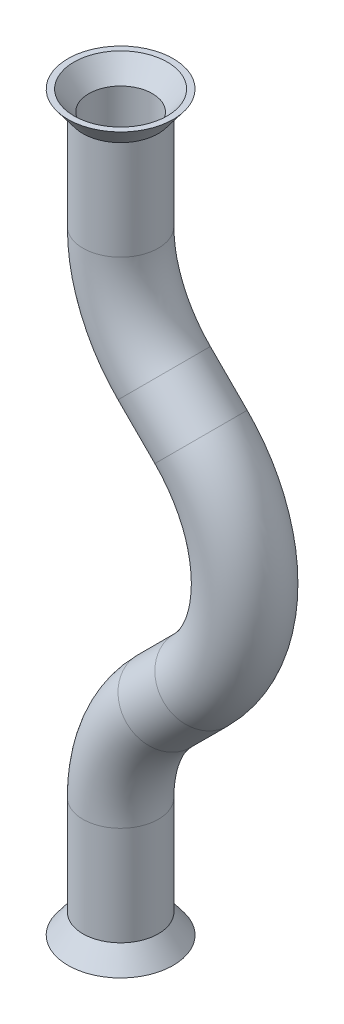
ISO-10303-21;
HEADER;
FILE_DESCRIPTION(('STEP AP214'),'2;1');
FILE_NAME('part.step','',(''),(''),'','','');
FILE_SCHEMA(('AUTOMOTIVE_DESIGN { 1 0 10303 214 1 1 1 1 }'));
ENDSEC;
DATA;
#1=APPLICATION_CONTEXT('core data for automotive mechanical design processes');
#2=APPLICATION_PROTOCOL_DEFINITION('international standard','automotive_design',2000,#1);
#3=PRODUCT_CONTEXT('',#1,'mechanical');
#4=PRODUCT('Part','Part','',(#3));
#5=PRODUCT_RELATED_PRODUCT_CATEGORY('part','',(#4));
#6=PRODUCT_DEFINITION_FORMATION('','',#4);
#7=PRODUCT_DEFINITION_CONTEXT('part definition',#1,'design');
#8=PRODUCT_DEFINITION('design','',#6,#7);
#9=PRODUCT_DEFINITION_SHAPE('','',#8);
#10=(LENGTH_UNIT() NAMED_UNIT(*) SI_UNIT(.MILLI.,.METRE.));
#11=(NAMED_UNIT(*) PLANE_ANGLE_UNIT() SI_UNIT($,.RADIAN.));
#12=(NAMED_UNIT(*) SI_UNIT($,.STERADIAN.) SOLID_ANGLE_UNIT());
#13=UNCERTAINTY_MEASURE_WITH_UNIT(LENGTH_MEASURE(1.E-05),#10,'distance_accuracy_value','');
#14=(GEOMETRIC_REPRESENTATION_CONTEXT(3) GLOBAL_UNCERTAINTY_ASSIGNED_CONTEXT((#13)) GLOBAL_UNIT_ASSIGNED_CONTEXT((#10,
#11,#12)) REPRESENTATION_CONTEXT('',''));
#15=CARTESIAN_POINT('',(0.,0.,0.));
#16=DIRECTION('',(0.,0.,1.));
#17=DIRECTION('',(1.,0.,0.));
#18=AXIS2_PLACEMENT_3D('',#15,#16,#17);
#19=CARTESIAN_POINT('',(0.,0.,0.));
#20=DIRECTION('',(0.,1.,0.));
#21=DIRECTION('',(0.,0.,1.));
#22=AXIS2_PLACEMENT_3D('',#19,#20,#21);
#23=CYLINDRICAL_SURFACE('',#22,4.826);
#24=CARTESIAN_POINT('',(0.,12.7,0.));
#25=DIRECTION('',(0.,1.,0.));
#26=DIRECTION('',(0.,0.,1.));
#27=AXIS2_PLACEMENT_3D('',#24,#25,#26);
#28=CIRCLE('',#27,4.826);
#29=CARTESIAN_POINT('',(-4.826,12.7,0.));
#30=VERTEX_POINT('',#29);
#31=EDGE_CURVE('E61',#30,#30,#28,.T.);
#32=ORIENTED_EDGE('',*,*,#31,.F.);
#33=EDGE_LOOP('',(#32));
#34=FACE_BOUND('',#33,.T.);
#35=CARTESIAN_POINT('',(0.,0.,0.));
#36=DIRECTION('',(0.,-1.,0.));
#37=DIRECTION('',(0.,0.,-1.));
#38=AXIS2_PLACEMENT_3D('',#35,#36,#37);
#39=CIRCLE('',#38,4.826);
#40=CARTESIAN_POINT('',(0.,0.,-4.826));
#41=VERTEX_POINT('',#40);
#42=EDGE_CURVE('E143',#41,#41,#39,.T.);
#43=ORIENTED_EDGE('',*,*,#42,.F.);
#44=EDGE_LOOP('',(#43));
#45=FACE_BOUND('',#44,.T.);
#46=ADVANCED_FACE('F37',(#34,#45),#23,.T.);
#47=CARTESIAN_POINT('',(19.05,12.7,0.));
#48=DIRECTION('',(0.,0.,-1.));
#49=DIRECTION('',(-1.,0.,0.));
#50=AXIS2_PLACEMENT_3D('',#47,#48,#49);
#51=TOROIDAL_SURFACE('',#50,19.05,4.826);
#52=CARTESIAN_POINT('',(5.5796158183963,26.1703841816037,0.));
#53=DIRECTION('',(0.707106781186549,0.707106781186546,0.));
#54=DIRECTION('',(0.,0.,1.));
#55=AXIS2_PLACEMENT_3D('',#52,#53,#54);
#56=CIRCLE('',#55,4.826);
#57=CARTESIAN_POINT('',(2.16711849239002,29.58288150761,0.));
#58=VERTEX_POINT('',#57);
#59=EDGE_CURVE('E65',#58,#58,#56,.T.);
#60=CARTESIAN_POINT('',(19.05,12.7,0.));
#61=DIRECTION('',(0.,0.,-1.));
#62=DIRECTION('',(-1.,0.,0.));
#63=AXIS2_PLACEMENT_3D('',#60,#61,#62);
#64=CIRCLE('',#63,23.876);
#65=EDGE_CURVE('',#30,#58,#64,.T.);
#66=ORIENTED_EDGE('',*,*,#31,.T.);
#67=ORIENTED_EDGE('',*,*,#59,.F.);
#68=ORIENTED_EDGE('',*,*,#65,.T.);
#69=ORIENTED_EDGE('',*,*,#65,.F.);
#70=EDGE_LOOP('',(#66,#68,#67,#69));
#71=FACE_BOUND('',#70,.T.);
#72=ADVANCED_FACE('F120',(#71),#51,.T.);
#73=CARTESIAN_POINT('',(5.5796158183963,26.1703841816037,0.));
#74=DIRECTION('',(0.707106781186547,0.707106781186548,0.));
#75=DIRECTION('',(-0.707106781186548,0.707106781186547,0.));
#76=AXIS2_PLACEMENT_3D('',#73,#74,#75);
#77=CYLINDRICAL_SURFACE('',#76,4.826);
#78=CARTESIAN_POINT('',(10.2953841816037,30.8861525448112,0.));
#79=DIRECTION('',(0.707106781186547,0.707106781186548,0.));
#80=DIRECTION('',(0.,0.,1.));
#81=AXIS2_PLACEMENT_3D('',#78,#79,#80);
#82=CIRCLE('',#81,4.826);
#83=CARTESIAN_POINT('',(13.70788150761,27.4736552188049,0.));
#84=VERTEX_POINT('',#83);
#85=EDGE_CURVE('E70',#84,#84,#82,.T.);
#86=ORIENTED_EDGE('',*,*,#85,.F.);
#87=EDGE_LOOP('',(#86));
#88=FACE_BOUND('',#87,.T.);
#89=ORIENTED_EDGE('',*,*,#59,.T.);
#90=EDGE_LOOP('',(#89));
#91=FACE_BOUND('',#90,.T.);
#92=ADVANCED_FACE('F124',(#88,#91),#77,.T.);
#93=CARTESIAN_POINT('',(-3.175,44.3565367264149,0.));
#94=DIRECTION('',(0.,0.,1.));
#95=DIRECTION('',(1.,0.,0.));
#96=AXIS2_PLACEMENT_3D('',#93,#94,#95);
#97=TOROIDAL_SURFACE('',#96,19.05,4.826);
#98=CARTESIAN_POINT('',(10.2953841816037,57.8269209080187,0.));
#99=DIRECTION('',(-0.707106781186549,0.707106781186546,0.));
#100=DIRECTION('',(0.,0.,1.));
#101=AXIS2_PLACEMENT_3D('',#98,#99,#100);
#102=CIRCLE('',#101,4.826);
#103=CARTESIAN_POINT('',(13.70788150761,61.2394182340249,0.));
#104=VERTEX_POINT('',#103);
#105=EDGE_CURVE('E74',#104,#104,#102,.T.);
#106=CARTESIAN_POINT('',(-3.175,44.3565367264149,0.));
#107=DIRECTION('',(0.,0.,1.));
#108=DIRECTION('',(1.,0.,0.));
#109=AXIS2_PLACEMENT_3D('',#106,#107,#108);
#110=CIRCLE('',#109,23.876);
#111=EDGE_CURVE('',#84,#104,#110,.T.);
#112=ORIENTED_EDGE('',*,*,#85,.T.);
#113=ORIENTED_EDGE('',*,*,#105,.F.);
#114=ORIENTED_EDGE('',*,*,#111,.T.);
#115=ORIENTED_EDGE('',*,*,#111,.F.);
#116=EDGE_LOOP('',(#112,#114,#113,#115));
#117=FACE_BOUND('',#116,.T.);
#118=ADVANCED_FACE('F96',(#117),#97,.T.);
#119=CARTESIAN_POINT('',(10.2953841816037,57.8269209080187,0.));
#120=DIRECTION('',(-0.707106781186547,0.707106781186548,0.));
#121=DIRECTION('',(-0.707106781186548,-0.707106781186547,0.));
#122=AXIS2_PLACEMENT_3D('',#119,#120,#121);
#123=CYLINDRICAL_SURFACE('',#122,4.826);
#124=CARTESIAN_POINT('',(5.5796158183963,62.5426892712261,0.));
#125=DIRECTION('',(-0.707106781186547,0.707106781186548,0.));
#126=DIRECTION('',(0.,0.,1.));
#127=AXIS2_PLACEMENT_3D('',#124,#125,#126);
#128=CIRCLE('',#127,4.826);
#129=CARTESIAN_POINT('',(2.16711849239003,59.1301919452198,0.));
#130=VERTEX_POINT('',#129);
#131=EDGE_CURVE('E77',#130,#130,#128,.T.);
#132=ORIENTED_EDGE('',*,*,#131,.F.);
#133=EDGE_LOOP('',(#132));
#134=FACE_BOUND('',#133,.T.);
#135=ORIENTED_EDGE('',*,*,#105,.T.);
#136=EDGE_LOOP('',(#135));
#137=FACE_BOUND('',#136,.T.);
#138=ADVANCED_FACE('F89',(#134,#137),#123,.T.);
#139=CARTESIAN_POINT('',(19.05,76.0130734528298,0.));
#140=DIRECTION('',(0.,0.,-1.));
#141=DIRECTION('',(-1.,0.,0.));
#142=AXIS2_PLACEMENT_3D('',#139,#140,#141);
#143=TOROIDAL_SURFACE('',#142,19.05,4.826);
#144=CARTESIAN_POINT('',(0.,76.0130734528298,0.));
#145=DIRECTION('',(0.,1.,0.));
#146=DIRECTION('',(0.,0.,1.));
#147=AXIS2_PLACEMENT_3D('',#144,#145,#146);
#148=CIRCLE('',#147,4.826);
#149=CARTESIAN_POINT('',(-4.82599999999999,76.0130734528298,0.));
#150=VERTEX_POINT('',#149);
#151=EDGE_CURVE('E41',#150,#150,#148,.T.);
#152=CARTESIAN_POINT('',(19.05,76.0130734528298,0.));
#153=DIRECTION('',(0.,0.,-1.));
#154=DIRECTION('',(-1.,0.,0.));
#155=AXIS2_PLACEMENT_3D('',#152,#153,#154);
#156=CIRCLE('',#155,23.876);
#157=EDGE_CURVE('',#130,#150,#156,.T.);
#158=ORIENTED_EDGE('',*,*,#131,.T.);
#159=ORIENTED_EDGE('',*,*,#151,.F.);
#160=ORIENTED_EDGE('',*,*,#157,.T.);
#161=ORIENTED_EDGE('',*,*,#157,.F.);
#162=EDGE_LOOP('',(#158,#160,#159,#161));
#163=FACE_BOUND('',#162,.T.);
#164=ADVANCED_FACE('F87',(#163),#143,.T.);
#165=CARTESIAN_POINT('',(0.,76.0130734528298,0.));
#166=DIRECTION('',(0.,1.,0.));
#167=DIRECTION('',(-1.,0.,0.));
#168=AXIS2_PLACEMENT_3D('',#165,#166,#167);
#169=CYLINDRICAL_SURFACE('',#168,4.826);
#170=CARTESIAN_POINT('',(0.,88.7130734528298,0.));
#171=DIRECTION('',(0.,1.,0.));
#172=DIRECTION('',(0.,0.,1.));
#173=AXIS2_PLACEMENT_3D('',#170,#171,#172);
#174=CIRCLE('',#173,4.826);
#175=CARTESIAN_POINT('',(0.,88.7130734528298,4.826));
#176=VERTEX_POINT('',#175);
#177=EDGE_CURVE('E56',#176,#176,#174,.T.);
#178=ORIENTED_EDGE('',*,*,#177,.F.);
#179=EDGE_LOOP('',(#178));
#180=FACE_BOUND('',#179,.T.);
#181=ORIENTED_EDGE('',*,*,#151,.T.);
#182=EDGE_LOOP('',(#181));
#183=FACE_BOUND('',#182,.T.);
#184=ADVANCED_FACE('F39',(#180,#183),#169,.T.);
#185=CARTESIAN_POINT('',(0.,0.,0.));
#186=DIRECTION('',(0.,1.,0.));
#187=DIRECTION('',(0.,0.,1.));
#188=AXIS2_PLACEMENT_3D('',#185,#186,#187);
#189=CYLINDRICAL_SURFACE('',#188,4.064);
#190=CARTESIAN_POINT('',(0.,12.7,0.));
#191=DIRECTION('',(0.,1.,0.));
#192=DIRECTION('',(0.,0.,1.));
#193=AXIS2_PLACEMENT_3D('',#190,#191,#192);
#194=CIRCLE('',#193,4.064);
#195=CARTESIAN_POINT('',(-4.064,12.7,0.));
#196=VERTEX_POINT('',#195);
#197=EDGE_CURVE('E60',#196,#196,#194,.F.);
#198=ORIENTED_EDGE('',*,*,#197,.F.);
#199=EDGE_LOOP('',(#198));
#200=FACE_BOUND('',#199,.T.);
#201=CARTESIAN_POINT('',(0.,0.,0.));
#202=DIRECTION('',(0.,-1.,0.));
#203=DIRECTION('',(0.,0.,-1.));
#204=AXIS2_PLACEMENT_3D('',#201,#202,#203);
#205=CIRCLE('',#204,4.064);
#206=CARTESIAN_POINT('',(0.,0.,-4.064));
#207=VERTEX_POINT('',#206);
#208=EDGE_CURVE('E146',#207,#207,#205,.T.);
#209=ORIENTED_EDGE('',*,*,#208,.T.);
#210=EDGE_LOOP('',(#209));
#211=FACE_BOUND('',#210,.T.);
#212=ADVANCED_FACE('F94',(#200,#211),#189,.F.);
#213=CARTESIAN_POINT('',(19.05,12.7,0.));
#214=DIRECTION('',(0.,0.,-1.));
#215=DIRECTION('',(-1.,0.,0.));
#216=AXIS2_PLACEMENT_3D('',#213,#214,#215);
#217=TOROIDAL_SURFACE('',#216,19.05,4.064);
#218=CARTESIAN_POINT('',(5.5796158183963,26.1703841816037,0.));
#219=DIRECTION('',(0.707106781186549,0.707106781186546,0.));
#220=DIRECTION('',(0.,0.,1.));
#221=AXIS2_PLACEMENT_3D('',#218,#219,#220);
#222=CIRCLE('',#221,4.064);
#223=CARTESIAN_POINT('',(2.70593385965417,29.0440661403459,0.));
#224=VERTEX_POINT('',#223);
#225=EDGE_CURVE('E160',#224,#224,#222,.F.);
#226=CARTESIAN_POINT('',(19.05,12.7,0.));
#227=DIRECTION('',(0.,0.,-1.));
#228=DIRECTION('',(-1.,0.,0.));
#229=AXIS2_PLACEMENT_3D('',#226,#227,#228);
#230=CIRCLE('',#229,23.114);
#231=EDGE_CURVE('',#196,#224,#230,.T.);
#232=ORIENTED_EDGE('',*,*,#197,.T.);
#233=ORIENTED_EDGE('',*,*,#225,.F.);
#234=ORIENTED_EDGE('',*,*,#231,.T.);
#235=ORIENTED_EDGE('',*,*,#231,.F.);
#236=EDGE_LOOP('',(#232,#234,#233,#235));
#237=FACE_BOUND('',#236,.T.);
#238=ADVANCED_FACE('F181',(#237),#217,.F.);
#239=CARTESIAN_POINT('',(5.5796158183963,26.1703841816037,0.));
#240=DIRECTION('',(0.707106781186547,0.707106781186548,0.));
#241=DIRECTION('',(-0.707106781186548,0.707106781186547,0.));
#242=AXIS2_PLACEMENT_3D('',#239,#240,#241);
#243=CYLINDRICAL_SURFACE('',#242,4.064);
#244=CARTESIAN_POINT('',(10.2953841816037,30.8861525448112,0.));
#245=DIRECTION('',(0.707106781186547,0.707106781186548,0.));
#246=DIRECTION('',(0.,0.,1.));
#247=AXIS2_PLACEMENT_3D('',#244,#245,#246);
#248=CIRCLE('',#247,4.064);
#249=CARTESIAN_POINT('',(13.1690661403458,28.012470586069,0.));
#250=VERTEX_POINT('',#249);
#251=EDGE_CURVE('E164',#250,#250,#248,.F.);
#252=ORIENTED_EDGE('',*,*,#251,.F.);
#253=EDGE_LOOP('',(#252));
#254=FACE_BOUND('',#253,.T.);
#255=ORIENTED_EDGE('',*,*,#225,.T.);
#256=EDGE_LOOP('',(#255));
#257=FACE_BOUND('',#256,.T.);
#258=ADVANCED_FACE('F175',(#254,#257),#243,.F.);
#259=CARTESIAN_POINT('',(-3.175,44.3565367264149,0.));
#260=DIRECTION('',(0.,0.,1.));
#261=DIRECTION('',(1.,0.,0.));
#262=AXIS2_PLACEMENT_3D('',#259,#260,#261);
#263=TOROIDAL_SURFACE('',#262,19.05,4.064);
#264=CARTESIAN_POINT('',(10.2953841816037,57.8269209080187,0.));
#265=DIRECTION('',(-0.707106781186549,0.707106781186546,0.));
#266=DIRECTION('',(0.,0.,1.));
#267=AXIS2_PLACEMENT_3D('',#264,#265,#266);
#268=CIRCLE('',#267,4.064);
#269=CARTESIAN_POINT('',(13.1690661403458,60.7006028667608,0.));
#270=VERTEX_POINT('',#269);
#271=EDGE_CURVE('E52',#270,#270,#268,.F.);
#272=CARTESIAN_POINT('',(-3.175,44.3565367264149,0.));
#273=DIRECTION('',(0.,0.,1.));
#274=DIRECTION('',(1.,0.,0.));
#275=AXIS2_PLACEMENT_3D('',#272,#273,#274);
#276=CIRCLE('',#275,23.114);
#277=EDGE_CURVE('',#250,#270,#276,.T.);
#278=ORIENTED_EDGE('',*,*,#251,.T.);
#279=ORIENTED_EDGE('',*,*,#271,.F.);
#280=ORIENTED_EDGE('',*,*,#277,.T.);
#281=ORIENTED_EDGE('',*,*,#277,.F.);
#282=EDGE_LOOP('',(#278,#280,#279,#281));
#283=FACE_BOUND('',#282,.T.);
#284=ADVANCED_FACE('F172',(#283),#263,.F.);
#285=CARTESIAN_POINT('',(10.2953841816037,57.8269209080187,0.));
#286=DIRECTION('',(-0.707106781186547,0.707106781186548,0.));
#287=DIRECTION('',(-0.707106781186548,-0.707106781186547,0.));
#288=AXIS2_PLACEMENT_3D('',#285,#286,#287);
#289=CYLINDRICAL_SURFACE('',#288,4.064);
#290=CARTESIAN_POINT('',(5.5796158183963,62.5426892712261,0.));
#291=DIRECTION('',(-0.707106781186547,0.707106781186548,0.));
#292=DIRECTION('',(0.,0.,1.));
#293=AXIS2_PLACEMENT_3D('',#290,#291,#292);
#294=CIRCLE('',#293,4.064);
#295=CARTESIAN_POINT('',(2.70593385965418,59.6690073124839,0.));
#296=VERTEX_POINT('',#295);
#297=EDGE_CURVE('E46',#296,#296,#294,.F.);
#298=ORIENTED_EDGE('',*,*,#297,.F.);
#299=EDGE_LOOP('',(#298));
#300=FACE_BOUND('',#299,.T.);
#301=ORIENTED_EDGE('',*,*,#271,.T.);
#302=EDGE_LOOP('',(#301));
#303=FACE_BOUND('',#302,.T.);
#304=ADVANCED_FACE('F112',(#300,#303),#289,.F.);
#305=CARTESIAN_POINT('',(19.05,76.0130734528298,0.));
#306=DIRECTION('',(0.,0.,-1.));
#307=DIRECTION('',(-1.,0.,0.));
#308=AXIS2_PLACEMENT_3D('',#305,#306,#307);
#309=TOROIDAL_SURFACE('',#308,19.05,4.064);
#310=CARTESIAN_POINT('',(0.,76.0130734528298,0.));
#311=DIRECTION('',(0.,1.,0.));
#312=DIRECTION('',(0.,0.,1.));
#313=AXIS2_PLACEMENT_3D('',#310,#311,#312);
#314=CIRCLE('',#313,4.064);
#315=CARTESIAN_POINT('',(-4.06399999999999,76.0130734528298,0.));
#316=VERTEX_POINT('',#315);
#317=EDGE_CURVE('E10',#316,#316,#314,.F.);
#318=CARTESIAN_POINT('',(19.05,76.0130734528298,0.));
#319=DIRECTION('',(0.,0.,-1.));
#320=DIRECTION('',(-1.,0.,0.));
#321=AXIS2_PLACEMENT_3D('',#318,#319,#320);
#322=CIRCLE('',#321,23.114);
#323=EDGE_CURVE('',#296,#316,#322,.T.);
#324=ORIENTED_EDGE('',*,*,#297,.T.);
#325=ORIENTED_EDGE('',*,*,#317,.F.);
#326=ORIENTED_EDGE('',*,*,#323,.T.);
#327=ORIENTED_EDGE('',*,*,#323,.F.);
#328=EDGE_LOOP('',(#324,#326,#325,#327));
#329=FACE_BOUND('',#328,.T.);
#330=ADVANCED_FACE('F102',(#329),#309,.F.);
#331=CARTESIAN_POINT('',(0.,76.0130734528298,0.));
#332=DIRECTION('',(0.,1.,0.));
#333=DIRECTION('',(-1.,0.,0.));
#334=AXIS2_PLACEMENT_3D('',#331,#332,#333);
#335=CYLINDRICAL_SURFACE('',#334,4.064);
#336=CARTESIAN_POINT('',(0.,88.7130734528298,0.));
#337=DIRECTION('',(0.,1.,0.));
#338=DIRECTION('',(0.,0.,1.));
#339=AXIS2_PLACEMENT_3D('',#336,#337,#338);
#340=CIRCLE('',#339,4.064);
#341=CARTESIAN_POINT('',(0.,88.7130734528298,4.064));
#342=VERTEX_POINT('',#341);
#343=EDGE_CURVE('E276',#342,#342,#340,.T.);
#344=ORIENTED_EDGE('',*,*,#343,.T.);
#345=EDGE_LOOP('',(#344));
#346=FACE_BOUND('',#345,.T.);
#347=ORIENTED_EDGE('',*,*,#317,.T.);
#348=EDGE_LOOP('',(#347));
#349=FACE_BOUND('',#348,.T.);
#350=ADVANCED_FACE('F99',(#346,#349),#335,.F.);
#351=CARTESIAN_POINT('',(0.,0.,0.));
#352=DIRECTION('',(0.,-1.,0.));
#353=DIRECTION('',(0.,0.,-1.));
#354=AXIS2_PLACEMENT_3D('',#351,#352,#353);
#355=CONICAL_SURFACE('',#354,4.826,0.645771823237903);
#356=CARTESIAN_POINT('',(0.,-2.54,0.));
#357=DIRECTION('',(0.,-1.,0.));
#358=DIRECTION('',(0.,0.,-1.));
#359=AXIS2_PLACEMENT_3D('',#356,#357,#358);
#360=CIRCLE('',#359,6.7400272872611);
#361=CARTESIAN_POINT('',(0.,-2.54,-6.7400272872611));
#362=VERTEX_POINT('',#361);
#363=EDGE_CURVE('E66',#362,#362,#360,.T.);
#364=ORIENTED_EDGE('',*,*,#363,.F.);
#365=EDGE_LOOP('',(#364));
#366=FACE_BOUND('',#365,.T.);
#367=ORIENTED_EDGE('',*,*,#42,.T.);
#368=EDGE_LOOP('',(#367));
#369=FACE_BOUND('',#368,.T.);
#370=ADVANCED_FACE('F101',(#366,#369),#355,.T.);
#371=CARTESIAN_POINT('',(0.,-2.54,0.));
#372=DIRECTION('',(0.,-1.,0.));
#373=DIRECTION('',(0.,0.,-1.));
#374=AXIS2_PLACEMENT_3D('',#371,#372,#373);
#375=PLANE('',#374);
#376=CARTESIAN_POINT('',(0.,-2.54,0.));
#377=DIRECTION('',(0.,-1.,0.));
#378=DIRECTION('',(0.,0.,-1.));
#379=AXIS2_PLACEMENT_3D('',#376,#377,#378);
#380=CIRCLE('',#379,5.9780272872611);
#381=CARTESIAN_POINT('',(0.,-2.54,-5.9780272872611));
#382=VERTEX_POINT('',#381);
#383=EDGE_CURVE('E153',#382,#382,#380,.T.);
#384=ORIENTED_EDGE('',*,*,#383,.F.);
#385=EDGE_LOOP('',(#384));
#386=FACE_BOUND('',#385,.T.);
#387=ORIENTED_EDGE('',*,*,#363,.T.);
#388=EDGE_LOOP('',(#387));
#389=FACE_BOUND('',#388,.T.);
#390=ADVANCED_FACE('F109',(#386,#389),#375,.T.);
#391=CARTESIAN_POINT('',(0.,-2.54,0.));
#392=DIRECTION('',(0.,-1.,0.));
#393=DIRECTION('',(0.,0.,-1.));
#394=AXIS2_PLACEMENT_3D('',#391,#392,#393);
#395=CONICAL_SURFACE('',#394,5.9780272872611,0.645771823237903);
#396=ORIENTED_EDGE('',*,*,#383,.T.);
#397=EDGE_LOOP('',(#396));
#398=FACE_BOUND('',#397,.T.);
#399=ORIENTED_EDGE('',*,*,#208,.F.);
#400=EDGE_LOOP('',(#399));
#401=FACE_BOUND('',#400,.T.);
#402=ADVANCED_FACE('F195',(#398,#401),#395,.F.);
#403=CARTESIAN_POINT('',(0.,88.7130734528298,0.));
#404=DIRECTION('',(0.,1.,0.));
#405=DIRECTION('',(0.,0.,1.));
#406=AXIS2_PLACEMENT_3D('',#403,#404,#405);
#407=CONICAL_SURFACE('',#406,4.826,0.645771823237903);
#408=CARTESIAN_POINT('',(0.,91.2530734528298,0.));
#409=DIRECTION('',(0.,1.,0.));
#410=DIRECTION('',(0.,0.,1.));
#411=AXIS2_PLACEMENT_3D('',#408,#409,#410);
#412=CIRCLE('',#411,6.7400272872611);
#413=CARTESIAN_POINT('',(0.,91.2530734528298,6.7400272872611));
#414=VERTEX_POINT('',#413);
#415=EDGE_CURVE('E278',#414,#414,#412,.T.);
#416=ORIENTED_EDGE('',*,*,#415,.F.);
#417=EDGE_LOOP('',(#416));
#418=FACE_BOUND('',#417,.T.);
#419=ORIENTED_EDGE('',*,*,#177,.T.);
#420=EDGE_LOOP('',(#419));
#421=FACE_BOUND('',#420,.T.);
#422=ADVANCED_FACE('F197',(#418,#421),#407,.T.);
#423=CARTESIAN_POINT('',(0.,91.2530734528298,0.));
#424=DIRECTION('',(0.,1.,0.));
#425=DIRECTION('',(0.,0.,1.));
#426=AXIS2_PLACEMENT_3D('',#423,#424,#425);
#427=PLANE('',#426);
#428=CARTESIAN_POINT('',(0.,91.2530734528298,0.));
#429=DIRECTION('',(0.,1.,0.));
#430=DIRECTION('',(0.,0.,1.));
#431=AXIS2_PLACEMENT_3D('',#428,#429,#430);
#432=CIRCLE('',#431,5.97802728726111);
#433=CARTESIAN_POINT('',(0.,91.2530734528298,5.97802728726111));
#434=VERTEX_POINT('',#433);
#435=EDGE_CURVE('E274',#434,#434,#432,.T.);
#436=ORIENTED_EDGE('',*,*,#435,.F.);
#437=EDGE_LOOP('',(#436));
#438=FACE_BOUND('',#437,.T.);
#439=ORIENTED_EDGE('',*,*,#415,.T.);
#440=EDGE_LOOP('',(#439));
#441=FACE_BOUND('',#440,.T.);
#442=ADVANCED_FACE('F204',(#438,#441),#427,.T.);
#443=CARTESIAN_POINT('',(0.,91.2530734528298,0.));
#444=DIRECTION('',(0.,1.,0.));
#445=DIRECTION('',(0.,0.,1.));
#446=AXIS2_PLACEMENT_3D('',#443,#444,#445);
#447=CONICAL_SURFACE('',#446,5.97802728726111,0.645771823237903);
#448=ORIENTED_EDGE('',*,*,#435,.T.);
#449=EDGE_LOOP('',(#448));
#450=FACE_BOUND('',#449,.T.);
#451=ORIENTED_EDGE('',*,*,#343,.F.);
#452=EDGE_LOOP('',(#451));
#453=FACE_BOUND('',#452,.T.);
#454=ADVANCED_FACE('F258',(#450,#453),#447,.F.);
#455=CLOSED_SHELL('',(#46,#72,#92,#118,#138,#164,#184,#212,#238,#258,#284,#304,#330,#350,#370,
#390,#402,#422,#442,#454));
#456=MANIFOLD_SOLID_BREP('B2',#455);
#457=ADVANCED_BREP_SHAPE_REPRESENTATION('',(#18,#456),#14);
#458=SHAPE_DEFINITION_REPRESENTATION(#9,#457);
ENDSEC;
END-ISO-10303-21;
